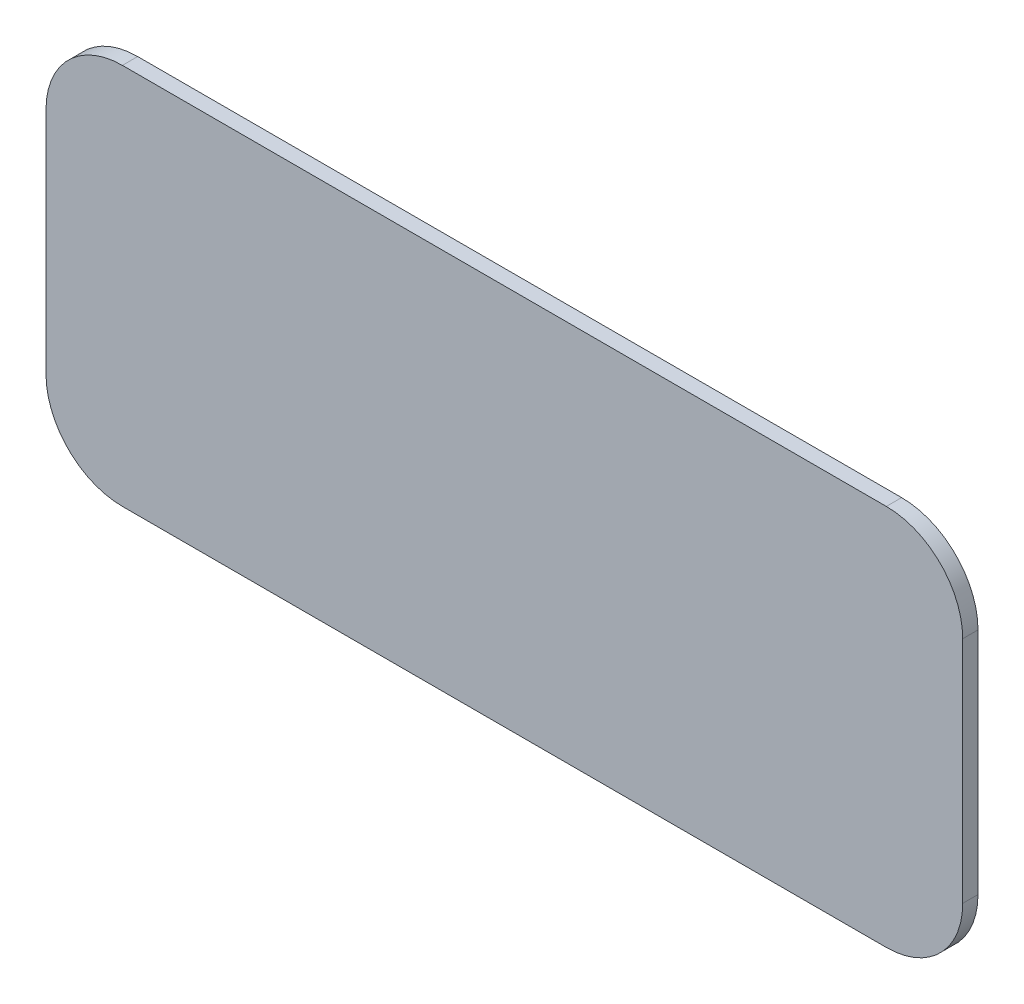
ISO-10303-21;
HEADER;
FILE_DESCRIPTION(('STEP AP214'),'2;1');
FILE_NAME('part.step','',(''),(''),'','','');
FILE_SCHEMA(('AUTOMOTIVE_DESIGN { 1 0 10303 214 1 1 1 1 }'));
ENDSEC;
DATA;
#1=APPLICATION_CONTEXT('core data for automotive mechanical design processes');
#2=APPLICATION_PROTOCOL_DEFINITION('international standard','automotive_design',2000,#1);
#3=PRODUCT_CONTEXT('',#1,'mechanical');
#4=PRODUCT('Part','Part','',(#3));
#5=PRODUCT_RELATED_PRODUCT_CATEGORY('part','',(#4));
#6=PRODUCT_DEFINITION_FORMATION('','',#4);
#7=PRODUCT_DEFINITION_CONTEXT('part definition',#1,'design');
#8=PRODUCT_DEFINITION('design','',#6,#7);
#9=PRODUCT_DEFINITION_SHAPE('','',#8);
#10=(LENGTH_UNIT() NAMED_UNIT(*) SI_UNIT(.MILLI.,.METRE.));
#11=(NAMED_UNIT(*) PLANE_ANGLE_UNIT() SI_UNIT($,.RADIAN.));
#12=(NAMED_UNIT(*) SI_UNIT($,.STERADIAN.) SOLID_ANGLE_UNIT());
#13=UNCERTAINTY_MEASURE_WITH_UNIT(LENGTH_MEASURE(1.E-05),#10,'distance_accuracy_value','');
#14=(GEOMETRIC_REPRESENTATION_CONTEXT(3) GLOBAL_UNCERTAINTY_ASSIGNED_CONTEXT((#13)) GLOBAL_UNIT_ASSIGNED_CONTEXT((#10,
#11,#12)) REPRESENTATION_CONTEXT('',''));
#15=CARTESIAN_POINT('',(0.,0.,0.));
#16=DIRECTION('',(0.,0.,1.));
#17=DIRECTION('',(1.,0.,0.));
#18=AXIS2_PLACEMENT_3D('',#15,#16,#17);
#19=CARTESIAN_POINT('',(50.0000000000002,18.0072835184039,2.));
#20=DIRECTION('',(0.,0.,-1.));
#21=DIRECTION('',(-1.,0.,0.));
#22=AXIS2_PLACEMENT_3D('',#19,#20,#21);
#23=CYLINDRICAL_SURFACE('',#22,9.99999999999999);
#24=CARTESIAN_POINT('',(50.0000000000002,18.0072835184039,0.));
#25=DIRECTION('',(0.,0.,1.));
#26=DIRECTION('',(1.,0.,0.));
#27=AXIS2_PLACEMENT_3D('',#24,#25,#26);
#28=CIRCLE('',#27,9.99999999999999);
#29=CARTESIAN_POINT('',(60.0000000000001,18.0072835184039,0.));
#30=VERTEX_POINT('',#29);
#31=CARTESIAN_POINT('',(50.0000000000001,28.0072835184039,0.));
#32=VERTEX_POINT('',#31);
#33=EDGE_CURVE('E129',#30,#32,#28,.T.);
#34=ORIENTED_EDGE('',*,*,#33,.T.);
#35=DIRECTION('',(0.,0.,-1.));
#36=VECTOR('',#35,1.);
#37=CARTESIAN_POINT('',(50.0000000000001,28.0072835184039,2.));
#38=LINE('',#37,#36);
#39=CARTESIAN_POINT('',(50.0000000000001,28.0072835184039,2.));
#40=VERTEX_POINT('',#39);
#41=EDGE_CURVE('E11',#40,#32,#38,.T.);
#42=ORIENTED_EDGE('',*,*,#41,.F.);
#43=CARTESIAN_POINT('',(50.0000000000002,18.0072835184039,2.));
#44=DIRECTION('',(0.,0.,1.));
#45=DIRECTION('',(1.,0.,0.));
#46=AXIS2_PLACEMENT_3D('',#43,#44,#45);
#47=CIRCLE('',#46,9.99999999999999);
#48=CARTESIAN_POINT('',(60.0000000000001,18.0072835184039,2.));
#49=VERTEX_POINT('',#48);
#50=EDGE_CURVE('E143',#49,#40,#47,.T.);
#51=ORIENTED_EDGE('',*,*,#50,.F.);
#52=DIRECTION('',(0.,0.,-1.));
#53=VECTOR('',#52,1.);
#54=CARTESIAN_POINT('',(60.0000000000001,18.0072835184039,2.));
#55=LINE('',#54,#53);
#56=EDGE_CURVE('E125',#49,#30,#55,.T.);
#57=ORIENTED_EDGE('',*,*,#56,.T.);
#58=EDGE_LOOP('',(#34,#42,#51,#57));
#59=FACE_BOUND('',#58,.T.);
#60=ADVANCED_FACE('F33',(#59),#23,.T.);
#61=CARTESIAN_POINT('',(50.0000000000001,28.0072835184039,2.));
#62=DIRECTION('',(0.,-1.,0.));
#63=DIRECTION('',(1.,0.,0.));
#64=AXIS2_PLACEMENT_3D('',#61,#62,#63);
#65=PLANE('',#64);
#66=DIRECTION('',(-1.,0.,0.));
#67=VECTOR('',#66,1.);
#68=CARTESIAN_POINT('',(50.0000000000001,28.0072835184039,0.));
#69=LINE('',#68,#67);
#70=CARTESIAN_POINT('',(-49.9999999999998,28.0072835184039,0.));
#71=VERTEX_POINT('',#70);
#72=EDGE_CURVE('E132',#32,#71,#69,.T.);
#73=ORIENTED_EDGE('',*,*,#72,.T.);
#74=DIRECTION('',(0.,0.,-1.));
#75=VECTOR('',#74,1.);
#76=CARTESIAN_POINT('',(-49.9999999999998,28.0072835184039,2.));
#77=LINE('',#76,#75);
#78=CARTESIAN_POINT('',(-49.9999999999998,28.0072835184039,2.));
#79=VERTEX_POINT('',#78);
#80=EDGE_CURVE('E41',#79,#71,#77,.T.);
#81=ORIENTED_EDGE('',*,*,#80,.F.);
#82=DIRECTION('',(-1.,0.,0.));
#83=VECTOR('',#82,1.);
#84=CARTESIAN_POINT('',(50.0000000000001,28.0072835184039,2.));
#85=LINE('',#84,#83);
#86=EDGE_CURVE('E92',#40,#79,#85,.T.);
#87=ORIENTED_EDGE('',*,*,#86,.F.);
#88=ORIENTED_EDGE('',*,*,#41,.T.);
#89=EDGE_LOOP('',(#73,#81,#87,#88));
#90=FACE_BOUND('',#89,.T.);
#91=ADVANCED_FACE('F178',(#90),#65,.F.);
#92=CARTESIAN_POINT('',(-49.9999999999999,18.0072835184039,2.));
#93=DIRECTION('',(0.,0.,-1.));
#94=DIRECTION('',(-1.,0.,0.));
#95=AXIS2_PLACEMENT_3D('',#92,#93,#94);
#96=CYLINDRICAL_SURFACE('',#95,10.);
#97=CARTESIAN_POINT('',(-49.9999999999999,18.0072835184039,0.));
#98=DIRECTION('',(0.,0.,1.));
#99=DIRECTION('',(1.,0.,0.));
#100=AXIS2_PLACEMENT_3D('',#97,#98,#99);
#101=CIRCLE('',#100,10.);
#102=CARTESIAN_POINT('',(-59.9999999999999,18.0072835184039,0.));
#103=VERTEX_POINT('',#102);
#104=EDGE_CURVE('E134',#71,#103,#101,.T.);
#105=ORIENTED_EDGE('',*,*,#104,.T.);
#106=DIRECTION('',(0.,0.,-1.));
#107=VECTOR('',#106,1.);
#108=CARTESIAN_POINT('',(-59.9999999999999,18.0072835184039,2.));
#109=LINE('',#108,#107);
#110=CARTESIAN_POINT('',(-59.9999999999999,18.0072835184039,2.));
#111=VERTEX_POINT('',#110);
#112=EDGE_CURVE('E150',#111,#103,#109,.T.);
#113=ORIENTED_EDGE('',*,*,#112,.F.);
#114=CARTESIAN_POINT('',(-49.9999999999999,18.0072835184039,2.));
#115=DIRECTION('',(0.,0.,1.));
#116=DIRECTION('',(1.,0.,0.));
#117=AXIS2_PLACEMENT_3D('',#114,#115,#116);
#118=CIRCLE('',#117,10.);
#119=EDGE_CURVE('E158',#79,#111,#118,.T.);
#120=ORIENTED_EDGE('',*,*,#119,.F.);
#121=ORIENTED_EDGE('',*,*,#80,.T.);
#122=EDGE_LOOP('',(#105,#113,#120,#121));
#123=FACE_BOUND('',#122,.T.);
#124=ADVANCED_FACE('F156',(#123),#96,.T.);
#125=CARTESIAN_POINT('',(-59.9999999999999,18.0072835184039,2.));
#126=DIRECTION('',(1.,0.,0.));
#127=DIRECTION('',(0.,1.,0.));
#128=AXIS2_PLACEMENT_3D('',#125,#126,#127);
#129=PLANE('',#128);
#130=DIRECTION('',(0.,-1.,0.));
#131=VECTOR('',#130,1.);
#132=CARTESIAN_POINT('',(-59.9999999999999,18.0072835184039,0.));
#133=LINE('',#132,#131);
#134=CARTESIAN_POINT('',(-59.9999999999999,-11.992716481596,0.));
#135=VERTEX_POINT('',#134);
#136=EDGE_CURVE('E136',#103,#135,#133,.T.);
#137=ORIENTED_EDGE('',*,*,#136,.T.);
#138=DIRECTION('',(0.,0.,-1.));
#139=VECTOR('',#138,1.);
#140=CARTESIAN_POINT('',(-59.9999999999999,-11.992716481596,2.));
#141=LINE('',#140,#139);
#142=CARTESIAN_POINT('',(-59.9999999999999,-11.992716481596,2.));
#143=VERTEX_POINT('',#142);
#144=EDGE_CURVE('E147',#143,#135,#141,.T.);
#145=ORIENTED_EDGE('',*,*,#144,.F.);
#146=DIRECTION('',(0.,-1.,0.));
#147=VECTOR('',#146,1.);
#148=CARTESIAN_POINT('',(-59.9999999999999,18.0072835184039,2.));
#149=LINE('',#148,#147);
#150=EDGE_CURVE('E170',#111,#143,#149,.T.);
#151=ORIENTED_EDGE('',*,*,#150,.F.);
#152=ORIENTED_EDGE('',*,*,#112,.T.);
#153=EDGE_LOOP('',(#137,#145,#151,#152));
#154=FACE_BOUND('',#153,.T.);
#155=ADVANCED_FACE('F166',(#154),#129,.F.);
#156=CARTESIAN_POINT('',(-49.9999999999999,-11.9927164815961,2.));
#157=DIRECTION('',(0.,0.,-1.));
#158=DIRECTION('',(-1.,0.,0.));
#159=AXIS2_PLACEMENT_3D('',#156,#157,#158);
#160=CYLINDRICAL_SURFACE('',#159,10.);
#161=CARTESIAN_POINT('',(-49.9999999999999,-11.9927164815961,0.));
#162=DIRECTION('',(0.,0.,1.));
#163=DIRECTION('',(1.,0.,0.));
#164=AXIS2_PLACEMENT_3D('',#161,#162,#163);
#165=CIRCLE('',#164,10.);
#166=CARTESIAN_POINT('',(-49.9999999999998,-21.9927164815961,0.));
#167=VERTEX_POINT('',#166);
#168=EDGE_CURVE('E138',#135,#167,#165,.T.);
#169=ORIENTED_EDGE('',*,*,#168,.T.);
#170=DIRECTION('',(0.,0.,-1.));
#171=VECTOR('',#170,1.);
#172=CARTESIAN_POINT('',(-49.9999999999998,-21.9927164815961,2.));
#173=LINE('',#172,#171);
#174=CARTESIAN_POINT('',(-49.9999999999998,-21.9927164815961,2.));
#175=VERTEX_POINT('',#174);
#176=EDGE_CURVE('E120',#175,#167,#173,.T.);
#177=ORIENTED_EDGE('',*,*,#176,.F.);
#178=CARTESIAN_POINT('',(-49.9999999999999,-11.9927164815961,2.));
#179=DIRECTION('',(0.,0.,1.));
#180=DIRECTION('',(1.,0.,0.));
#181=AXIS2_PLACEMENT_3D('',#178,#179,#180);
#182=CIRCLE('',#181,10.);
#183=EDGE_CURVE('E111',#143,#175,#182,.T.);
#184=ORIENTED_EDGE('',*,*,#183,.F.);
#185=ORIENTED_EDGE('',*,*,#144,.T.);
#186=EDGE_LOOP('',(#169,#177,#184,#185));
#187=FACE_BOUND('',#186,.T.);
#188=ADVANCED_FACE('F169',(#187),#160,.T.);
#189=CARTESIAN_POINT('',(-49.9999999999998,-21.9927164815961,2.));
#190=DIRECTION('',(0.,1.,0.));
#191=DIRECTION('',(0.,0.,1.));
#192=AXIS2_PLACEMENT_3D('',#189,#190,#191);
#193=PLANE('',#192);
#194=DIRECTION('',(1.,0.,0.));
#195=VECTOR('',#194,1.);
#196=CARTESIAN_POINT('',(-49.9999999999998,-21.9927164815961,0.));
#197=LINE('',#196,#195);
#198=CARTESIAN_POINT('',(50.0000000000001,-21.9927164815961,0.));
#199=VERTEX_POINT('',#198);
#200=EDGE_CURVE('E119',#167,#199,#197,.T.);
#201=ORIENTED_EDGE('',*,*,#200,.T.);
#202=DIRECTION('',(0.,0.,-1.));
#203=VECTOR('',#202,1.);
#204=CARTESIAN_POINT('',(50.0000000000001,-21.9927164815961,2.));
#205=LINE('',#204,#203);
#206=CARTESIAN_POINT('',(50.0000000000001,-21.9927164815961,2.));
#207=VERTEX_POINT('',#206);
#208=EDGE_CURVE('E116',#207,#199,#205,.T.);
#209=ORIENTED_EDGE('',*,*,#208,.F.);
#210=DIRECTION('',(1.,0.,0.));
#211=VECTOR('',#210,1.);
#212=CARTESIAN_POINT('',(-49.9999999999998,-21.9927164815961,2.));
#213=LINE('',#212,#211);
#214=EDGE_CURVE('E105',#175,#207,#213,.T.);
#215=ORIENTED_EDGE('',*,*,#214,.F.);
#216=ORIENTED_EDGE('',*,*,#176,.T.);
#217=EDGE_LOOP('',(#201,#209,#215,#216));
#218=FACE_BOUND('',#217,.T.);
#219=ADVANCED_FACE('F117',(#218),#193,.F.);
#220=CARTESIAN_POINT('',(50.0000000000001,-11.9927164815961,2.));
#221=DIRECTION('',(0.,0.,-1.));
#222=DIRECTION('',(-1.,0.,0.));
#223=AXIS2_PLACEMENT_3D('',#220,#221,#222);
#224=CYLINDRICAL_SURFACE('',#223,10.);
#225=CARTESIAN_POINT('',(50.0000000000001,-11.9927164815961,0.));
#226=DIRECTION('',(0.,0.,1.));
#227=DIRECTION('',(1.,0.,0.));
#228=AXIS2_PLACEMENT_3D('',#225,#226,#227);
#229=CIRCLE('',#228,10.);
#230=CARTESIAN_POINT('',(60.0000000000001,-11.9927164815961,0.));
#231=VERTEX_POINT('',#230);
#232=EDGE_CURVE('E78',#199,#231,#229,.T.);
#233=ORIENTED_EDGE('',*,*,#232,.T.);
#234=DIRECTION('',(0.,0.,-1.));
#235=VECTOR('',#234,1.);
#236=CARTESIAN_POINT('',(60.0000000000001,-11.9927164815961,2.));
#237=LINE('',#236,#235);
#238=CARTESIAN_POINT('',(60.0000000000001,-11.9927164815961,2.));
#239=VERTEX_POINT('',#238);
#240=EDGE_CURVE('E121',#239,#231,#237,.T.);
#241=ORIENTED_EDGE('',*,*,#240,.F.);
#242=CARTESIAN_POINT('',(50.0000000000001,-11.9927164815961,2.));
#243=DIRECTION('',(0.,0.,1.));
#244=DIRECTION('',(1.,0.,0.));
#245=AXIS2_PLACEMENT_3D('',#242,#243,#244);
#246=CIRCLE('',#245,10.);
#247=EDGE_CURVE('E109',#207,#239,#246,.T.);
#248=ORIENTED_EDGE('',*,*,#247,.F.);
#249=ORIENTED_EDGE('',*,*,#208,.T.);
#250=EDGE_LOOP('',(#233,#241,#248,#249));
#251=FACE_BOUND('',#250,.T.);
#252=ADVANCED_FACE('F123',(#251),#224,.T.);
#253=CARTESIAN_POINT('',(60.0000000000001,-11.9927164815961,2.));
#254=DIRECTION('',(-1.,0.,0.));
#255=DIRECTION('',(0.,0.,1.));
#256=AXIS2_PLACEMENT_3D('',#253,#254,#255);
#257=PLANE('',#256);
#258=DIRECTION('',(0.,1.,0.));
#259=VECTOR('',#258,1.);
#260=CARTESIAN_POINT('',(60.0000000000001,-11.9927164815961,0.));
#261=LINE('',#260,#259);
#262=EDGE_CURVE('E84',#231,#30,#261,.T.);
#263=ORIENTED_EDGE('',*,*,#262,.T.);
#264=ORIENTED_EDGE('',*,*,#56,.F.);
#265=DIRECTION('',(0.,1.,0.));
#266=VECTOR('',#265,1.);
#267=CARTESIAN_POINT('',(60.0000000000001,-11.9927164815961,2.));
#268=LINE('',#267,#266);
#269=EDGE_CURVE('E49',#239,#49,#268,.T.);
#270=ORIENTED_EDGE('',*,*,#269,.F.);
#271=ORIENTED_EDGE('',*,*,#240,.T.);
#272=EDGE_LOOP('',(#263,#264,#270,#271));
#273=FACE_BOUND('',#272,.T.);
#274=ADVANCED_FACE('F194',(#273),#257,.F.);
#275=CARTESIAN_POINT('',(50.0000000000002,18.0072835184039,2.));
#276=DIRECTION('',(0.,0.,1.));
#277=DIRECTION('',(1.,0.,0.));
#278=AXIS2_PLACEMENT_3D('',#275,#276,#277);
#279=PLANE('',#278);
#280=ORIENTED_EDGE('',*,*,#50,.T.);
#281=ORIENTED_EDGE('',*,*,#86,.T.);
#282=ORIENTED_EDGE('',*,*,#119,.T.);
#283=ORIENTED_EDGE('',*,*,#150,.T.);
#284=ORIENTED_EDGE('',*,*,#183,.T.);
#285=ORIENTED_EDGE('',*,*,#214,.T.);
#286=ORIENTED_EDGE('',*,*,#247,.T.);
#287=ORIENTED_EDGE('',*,*,#269,.T.);
#288=EDGE_LOOP('',(#280,#281,#282,#283,#284,#285,#286,#287));
#289=FACE_BOUND('',#288,.T.);
#290=ADVANCED_FACE('F107',(#289),#279,.T.);
#291=CARTESIAN_POINT('',(50.0000000000002,18.0072835184039,0.));
#292=DIRECTION('',(0.,0.,1.));
#293=DIRECTION('',(1.,0.,0.));
#294=AXIS2_PLACEMENT_3D('',#291,#292,#293);
#295=PLANE('',#294);
#296=ORIENTED_EDGE('',*,*,#33,.F.);
#297=ORIENTED_EDGE('',*,*,#262,.F.);
#298=ORIENTED_EDGE('',*,*,#232,.F.);
#299=ORIENTED_EDGE('',*,*,#200,.F.);
#300=ORIENTED_EDGE('',*,*,#168,.F.);
#301=ORIENTED_EDGE('',*,*,#136,.F.);
#302=ORIENTED_EDGE('',*,*,#104,.F.);
#303=ORIENTED_EDGE('',*,*,#72,.F.);
#304=EDGE_LOOP('',(#296,#297,#298,#299,#300,#301,#302,#303));
#305=FACE_BOUND('',#304,.T.);
#306=ADVANCED_FACE('F162',(#305),#295,.F.);
#307=CLOSED_SHELL('',(#60,#91,#124,#155,#188,#219,#252,#274,#290,#306));
#308=MANIFOLD_SOLID_BREP('B2',#307);
#309=ADVANCED_BREP_SHAPE_REPRESENTATION('',(#18,#308),#14);
#310=SHAPE_DEFINITION_REPRESENTATION(#9,#309);
ENDSEC;
END-ISO-10303-21;
